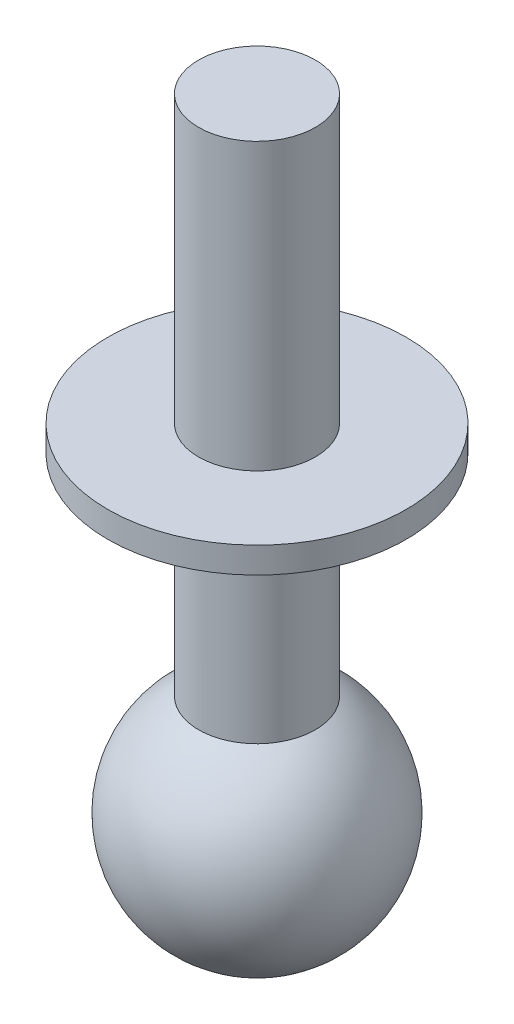
ISO-10303-21;
HEADER;
FILE_DESCRIPTION(('STEP AP214'),'2;1');
FILE_NAME('part.step','',(''),(''),'','','');
FILE_SCHEMA(('AUTOMOTIVE_DESIGN { 1 0 10303 214 1 1 1 1 }'));
ENDSEC;
DATA;
#1=APPLICATION_CONTEXT('core data for automotive mechanical design processes');
#2=APPLICATION_PROTOCOL_DEFINITION('international standard','automotive_design',2000,#1);
#3=PRODUCT_CONTEXT('',#1,'mechanical');
#4=PRODUCT('Part','Part','',(#3));
#5=PRODUCT_RELATED_PRODUCT_CATEGORY('part','',(#4));
#6=PRODUCT_DEFINITION_FORMATION('','',#4);
#7=PRODUCT_DEFINITION_CONTEXT('part definition',#1,'design');
#8=PRODUCT_DEFINITION('design','',#6,#7);
#9=PRODUCT_DEFINITION_SHAPE('','',#8);
#10=(LENGTH_UNIT() NAMED_UNIT(*) SI_UNIT(.MILLI.,.METRE.));
#11=(NAMED_UNIT(*) PLANE_ANGLE_UNIT() SI_UNIT($,.RADIAN.));
#12=(NAMED_UNIT(*) SI_UNIT($,.STERADIAN.) SOLID_ANGLE_UNIT());
#13=UNCERTAINTY_MEASURE_WITH_UNIT(LENGTH_MEASURE(1.E-05),#10,'distance_accuracy_value','');
#14=(GEOMETRIC_REPRESENTATION_CONTEXT(3) GLOBAL_UNCERTAINTY_ASSIGNED_CONTEXT((#13)) GLOBAL_UNIT_ASSIGNED_CONTEXT((#10,
#11,#12)) REPRESENTATION_CONTEXT('',''));
#15=CARTESIAN_POINT('',(0.,0.,0.));
#16=DIRECTION('',(0.,0.,1.));
#17=DIRECTION('',(1.,0.,0.));
#18=AXIS2_PLACEMENT_3D('',#15,#16,#17);
#19=CARTESIAN_POINT('',(562.664114717674,50.,-9.40756169408781));
#20=DIRECTION('',(0.,-1.,0.));
#21=DIRECTION('',(0.,0.,-1.));
#22=AXIS2_PLACEMENT_3D('',#19,#20,#21);
#23=CYLINDRICAL_SURFACE('',#22,4.49999999999991);
#24=CARTESIAN_POINT('',(562.664114717674,9.79422863406001,-9.40756169408781));
#25=DIRECTION('',(0.,-1.,0.));
#26=DIRECTION('',(0.,0.,-1.));
#27=AXIS2_PLACEMENT_3D('',#24,#25,#26);
#28=CIRCLE('',#27,4.49999999999991);
#29=CARTESIAN_POINT('',(562.664114717674,9.79422863406001,-13.9075616940877));
#30=VERTEX_POINT('',#29);
#31=EDGE_CURVE('E51',#30,#30,#28,.F.);
#32=ORIENTED_EDGE('',*,*,#31,.T.);
#33=EDGE_LOOP('',(#32));
#34=FACE_BOUND('',#33,.T.);
#35=CARTESIAN_POINT('',(562.664114717674,26.,-9.40756169408781));
#36=DIRECTION('',(0.,1.,0.));
#37=DIRECTION('',(0.,0.,1.));
#38=AXIS2_PLACEMENT_3D('',#35,#36,#37);
#39=CIRCLE('',#38,4.49999999999991);
#40=CARTESIAN_POINT('',(562.664114717674,26.,-4.9075616940879));
#41=VERTEX_POINT('',#40);
#42=EDGE_CURVE('E10',#41,#41,#39,.T.);
#43=ORIENTED_EDGE('',*,*,#42,.F.);
#44=EDGE_LOOP('',(#43));
#45=FACE_BOUND('',#44,.T.);
#46=ADVANCED_FACE('F43',(#34,#45),#23,.T.);
#47=CARTESIAN_POINT('',(562.664114717674,2.,-9.40756169408781));
#48=DIRECTION('',(-1.,0.,0.));
#49=DIRECTION('',(0.,0.,-1.));
#50=AXIS2_PLACEMENT_3D('',#47,#48,#49);
#51=SPHERICAL_SURFACE('',#50,9.00000000000001);
#52=CARTESIAN_POINT('',(562.664114717674,2.,-9.40756169408781));
#53=DIRECTION('',(0.,-1.,0.));
#54=DIRECTION('',(0.,0.,-1.));
#55=AXIS2_PLACEMENT_3D('',#52,#53,#54);
#56=SPHERICAL_SURFACE('',#55,9.00000000000001);
#57=ORIENTED_EDGE('',*,*,#31,.F.);
#58=EDGE_LOOP('',(#57));
#59=FACE_BOUND('',#58,.T.);
#60=ADVANCED_FACE('F45',(#59),#56,.T.);
#61=CARTESIAN_POINT('',(562.664114717674,26.,-9.40756169408781));
#62=DIRECTION('',(0.,1.,0.));
#63=DIRECTION('',(0.,0.,1.));
#64=AXIS2_PLACEMENT_3D('',#61,#62,#63);
#65=CYLINDRICAL_SURFACE('',#64,11.4999999999999);
#66=CARTESIAN_POINT('',(562.664114717674,26.,-9.40756169408781));
#67=DIRECTION('',(0.,1.,0.));
#68=DIRECTION('',(0.,0.,1.));
#69=AXIS2_PLACEMENT_3D('',#66,#67,#68);
#70=CIRCLE('',#69,11.4999999999999);
#71=CARTESIAN_POINT('',(562.664114717674,26.,2.09243830591214));
#72=VERTEX_POINT('',#71);
#73=EDGE_CURVE('E68',#72,#72,#70,.T.);
#74=ORIENTED_EDGE('',*,*,#73,.T.);
#75=EDGE_LOOP('',(#74));
#76=FACE_BOUND('',#75,.T.);
#77=CARTESIAN_POINT('',(562.664114717674,28.,-9.40756169408781));
#78=DIRECTION('',(0.,1.,0.));
#79=DIRECTION('',(0.,0.,1.));
#80=AXIS2_PLACEMENT_3D('',#77,#78,#79);
#81=CIRCLE('',#80,11.4999999999999);
#82=CARTESIAN_POINT('',(562.664114717674,28.,2.09243830591214));
#83=VERTEX_POINT('',#82);
#84=EDGE_CURVE('E73',#83,#83,#81,.T.);
#85=ORIENTED_EDGE('',*,*,#84,.F.);
#86=EDGE_LOOP('',(#85));
#87=FACE_BOUND('',#86,.T.);
#88=ADVANCED_FACE('F82',(#76,#87),#65,.T.);
#89=CARTESIAN_POINT('',(562.664114717674,26.,-9.40756169408781));
#90=DIRECTION('',(0.,1.,0.));
#91=DIRECTION('',(0.,0.,1.));
#92=AXIS2_PLACEMENT_3D('',#89,#90,#91);
#93=PLANE('',#92);
#94=ORIENTED_EDGE('',*,*,#42,.T.);
#95=EDGE_LOOP('',(#94));
#96=FACE_BOUND('',#95,.T.);
#97=ORIENTED_EDGE('',*,*,#73,.F.);
#98=EDGE_LOOP('',(#97));
#99=FACE_BOUND('',#98,.T.);
#100=ADVANCED_FACE('F84',(#96,#99),#93,.F.);
#101=CARTESIAN_POINT('',(562.664114717674,28.,-9.40756169408781));
#102=DIRECTION('',(0.,1.,0.));
#103=DIRECTION('',(0.,0.,1.));
#104=AXIS2_PLACEMENT_3D('',#101,#102,#103);
#105=PLANE('',#104);
#106=CARTESIAN_POINT('',(562.664114717674,28.,-9.40756169408781));
#107=DIRECTION('',(0.,1.,0.));
#108=DIRECTION('',(0.,0.,1.));
#109=AXIS2_PLACEMENT_3D('',#106,#107,#108);
#110=CIRCLE('',#109,4.49999999999991);
#111=CARTESIAN_POINT('',(562.664114717674,28.,-4.9075616940879));
#112=VERTEX_POINT('',#111);
#113=EDGE_CURVE('E63',#112,#112,#110,.T.);
#114=ORIENTED_EDGE('',*,*,#113,.F.);
#115=EDGE_LOOP('',(#114));
#116=FACE_BOUND('',#115,.T.);
#117=ORIENTED_EDGE('',*,*,#84,.T.);
#118=EDGE_LOOP('',(#117));
#119=FACE_BOUND('',#118,.T.);
#120=ADVANCED_FACE('F80',(#116,#119),#105,.T.);
#121=CARTESIAN_POINT('',(562.664114717674,50.,-9.40756169408781));
#122=DIRECTION('',(0.,1.,0.));
#123=DIRECTION('',(0.,0.,1.));
#124=AXIS2_PLACEMENT_3D('',#121,#122,#123);
#125=PLANE('',#124);
#126=CARTESIAN_POINT('',(562.664114717674,50.,-9.40756169408781));
#127=DIRECTION('',(0.,1.,0.));
#128=DIRECTION('',(0.,0.,1.));
#129=AXIS2_PLACEMENT_3D('',#126,#127,#128);
#130=CIRCLE('',#129,4.49999999999991);
#131=CARTESIAN_POINT('',(562.664114717674,50.,-4.9075616940879));
#132=VERTEX_POINT('',#131);
#133=EDGE_CURVE('E57',#132,#132,#130,.T.);
#134=ORIENTED_EDGE('',*,*,#133,.T.);
#135=EDGE_LOOP('',(#134));
#136=FACE_BOUND('',#135,.T.);
#137=ADVANCED_FACE('F102',(#136),#125,.T.);
#138=ORIENTED_EDGE('',*,*,#113,.T.);
#139=EDGE_LOOP('',(#138));
#140=FACE_BOUND('',#139,.T.);
#141=ORIENTED_EDGE('',*,*,#133,.F.);
#142=EDGE_LOOP('',(#141));
#143=FACE_BOUND('',#142,.T.);
#144=ADVANCED_FACE('F96',(#140,#143),#23,.T.);
#145=CLOSED_SHELL('',(#46,#60,#88,#100,#120,#137,#144));
#146=MANIFOLD_SOLID_BREP('B2',#145);
#147=ADVANCED_BREP_SHAPE_REPRESENTATION('',(#18,#146),#14);
#148=SHAPE_DEFINITION_REPRESENTATION(#9,#147);
ENDSEC;
END-ISO-10303-21;
